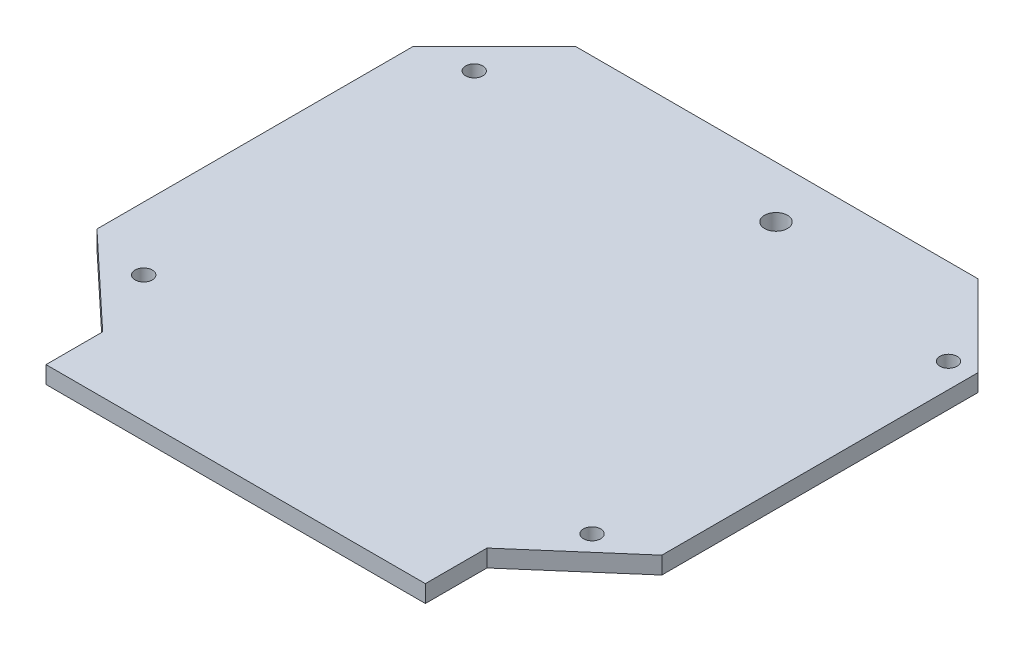
ISO-10303-21;
HEADER;
FILE_DESCRIPTION(('STEP AP214'),'2;1');
FILE_NAME('part.step','',(''),(''),'','','');
FILE_SCHEMA(('AUTOMOTIVE_DESIGN { 1 0 10303 214 1 1 1 1 }'));
ENDSEC;
DATA;
#1=APPLICATION_CONTEXT('core data for automotive mechanical design processes');
#2=APPLICATION_PROTOCOL_DEFINITION('international standard','automotive_design',2000,#1);
#3=PRODUCT_CONTEXT('',#1,'mechanical');
#4=PRODUCT('Part','Part','',(#3));
#5=PRODUCT_RELATED_PRODUCT_CATEGORY('part','',(#4));
#6=PRODUCT_DEFINITION_FORMATION('','',#4);
#7=PRODUCT_DEFINITION_CONTEXT('part definition',#1,'design');
#8=PRODUCT_DEFINITION('design','',#6,#7);
#9=PRODUCT_DEFINITION_SHAPE('','',#8);
#10=(LENGTH_UNIT() NAMED_UNIT(*) SI_UNIT(.MILLI.,.METRE.));
#11=(NAMED_UNIT(*) PLANE_ANGLE_UNIT() SI_UNIT($,.RADIAN.));
#12=(NAMED_UNIT(*) SI_UNIT($,.STERADIAN.) SOLID_ANGLE_UNIT());
#13=UNCERTAINTY_MEASURE_WITH_UNIT(LENGTH_MEASURE(1.E-05),#10,'distance_accuracy_value','');
#14=(GEOMETRIC_REPRESENTATION_CONTEXT(3) GLOBAL_UNCERTAINTY_ASSIGNED_CONTEXT((#13)) GLOBAL_UNIT_ASSIGNED_CONTEXT((#10,
#11,#12)) REPRESENTATION_CONTEXT('',''));
#15=CARTESIAN_POINT('',(0.,0.,0.));
#16=DIRECTION('',(0.,0.,1.));
#17=DIRECTION('',(1.,0.,0.));
#18=AXIS2_PLACEMENT_3D('',#15,#16,#17);
#19=CARTESIAN_POINT('',(0.,3.,0.));
#20=DIRECTION('',(0.,-1.,0.));
#21=DIRECTION('',(0.,0.,-1.));
#22=AXIS2_PLACEMENT_3D('',#19,#20,#21);
#23=PLANE('',#22);
#24=DIRECTION('',(-0.707106781186548,0.,0.707106781186547));
#25=VECTOR('',#24,1.);
#26=CARTESIAN_POINT('',(0.,3.,14.14));
#27=LINE('',#26,#25);
#28=CARTESIAN_POINT('',(14.14,3.,0.));
#29=VERTEX_POINT('',#28);
#30=CARTESIAN_POINT('',(0.,3.,14.14));
#31=VERTEX_POINT('',#30);
#32=EDGE_CURVE('E169',#29,#31,#27,.T.);
#33=ORIENTED_EDGE('',*,*,#32,.T.);
#34=DIRECTION('',(0.,0.,1.));
#35=VECTOR('',#34,1.);
#36=CARTESIAN_POINT('',(0.,3.,69.14));
#37=LINE('',#36,#35);
#38=CARTESIAN_POINT('',(0.,3.,69.14));
#39=VERTEX_POINT('',#38);
#40=EDGE_CURVE('E107',#31,#39,#37,.T.);
#41=ORIENTED_EDGE('',*,*,#40,.T.);
#42=DIRECTION('',(0.729537204140085,0.,0.68394112888133));
#43=VECTOR('',#42,1.);
#44=CARTESIAN_POINT('',(16.,3.,84.14));
#45=LINE('',#44,#43);
#46=CARTESIAN_POINT('',(16.,3.,84.14));
#47=VERTEX_POINT('',#46);
#48=EDGE_CURVE('E190',#39,#47,#45,.T.);
#49=ORIENTED_EDGE('',*,*,#48,.T.);
#50=DIRECTION('',(0.,0.,1.));
#51=VECTOR('',#50,1.);
#52=CARTESIAN_POINT('',(16.,3.,94.));
#53=LINE('',#52,#51);
#54=CARTESIAN_POINT('',(16.,3.,94.));
#55=VERTEX_POINT('',#54);
#56=EDGE_CURVE('E209',#47,#55,#53,.T.);
#57=ORIENTED_EDGE('',*,*,#56,.T.);
#58=DIRECTION('',(1.,0.,0.));
#59=VECTOR('',#58,1.);
#60=CARTESIAN_POINT('',(82.,3.,94.));
#61=LINE('',#60,#59);
#62=CARTESIAN_POINT('',(82.,3.,94.));
#63=VERTEX_POINT('',#62);
#64=EDGE_CURVE('E206',#55,#63,#61,.T.);
#65=ORIENTED_EDGE('',*,*,#64,.T.);
#66=DIRECTION('',(0.,0.,-1.));
#67=VECTOR('',#66,1.);
#68=CARTESIAN_POINT('',(82.,3.,83.28));
#69=LINE('',#68,#67);
#70=CARTESIAN_POINT('',(82.,3.,83.28));
#71=VERTEX_POINT('',#70);
#72=EDGE_CURVE('E208',#63,#71,#69,.T.);
#73=ORIENTED_EDGE('',*,*,#72,.T.);
#74=DIRECTION('',(0.754984782363871,0.,-0.65574231097206));
#75=VECTOR('',#74,1.);
#76=CARTESIAN_POINT('',(98.28,3.,69.14));
#77=LINE('',#76,#75);
#78=CARTESIAN_POINT('',(98.28,3.,69.14));
#79=VERTEX_POINT('',#78);
#80=EDGE_CURVE('E132',#71,#79,#77,.T.);
#81=ORIENTED_EDGE('',*,*,#80,.T.);
#82=DIRECTION('',(0.,0.,-1.));
#83=VECTOR('',#82,1.);
#84=CARTESIAN_POINT('',(98.28,3.,14.14));
#85=LINE('',#84,#83);
#86=CARTESIAN_POINT('',(98.28,3.,14.14));
#87=VERTEX_POINT('',#86);
#88=EDGE_CURVE('E126',#79,#87,#85,.T.);
#89=ORIENTED_EDGE('',*,*,#88,.T.);
#90=DIRECTION('',(-0.707106781186547,0.,-0.707106781186548));
#91=VECTOR('',#90,1.);
#92=CARTESIAN_POINT('',(84.14,3.,0.));
#93=LINE('',#92,#91);
#94=CARTESIAN_POINT('',(84.14,3.,0.));
#95=VERTEX_POINT('',#94);
#96=EDGE_CURVE('E130',#87,#95,#93,.T.);
#97=ORIENTED_EDGE('',*,*,#96,.T.);
#98=DIRECTION('',(-1.,0.,0.));
#99=VECTOR('',#98,1.);
#100=CARTESIAN_POINT('',(14.14,3.,0.));
#101=LINE('',#100,#99);
#102=EDGE_CURVE('E58',#95,#29,#101,.T.);
#103=ORIENTED_EDGE('',*,*,#102,.T.);
#104=EDGE_LOOP('',(#33,#41,#49,#57,#65,#73,#81,#89,#97,#103));
#105=FACE_BOUND('',#104,.T.);
#106=CARTESIAN_POINT('',(9.,3.,12.5));
#107=DIRECTION('',(0.,1.,0.));
#108=DIRECTION('',(0.,0.,1.));
#109=AXIS2_PLACEMENT_3D('',#106,#107,#108);
#110=CIRCLE('',#109,1.5);
#111=CARTESIAN_POINT('',(9.,3.,14.));
#112=VERTEX_POINT('',#111);
#113=EDGE_CURVE('E154',#112,#112,#110,.T.);
#114=ORIENTED_EDGE('',*,*,#113,.F.);
#115=EDGE_LOOP('',(#114));
#116=FACE_BOUND('',#115,.T.);
#117=CARTESIAN_POINT('',(94.,3.,15.));
#118=DIRECTION('',(0.,1.,0.));
#119=DIRECTION('',(0.,0.,1.));
#120=AXIS2_PLACEMENT_3D('',#117,#118,#119);
#121=CIRCLE('',#120,1.5);
#122=CARTESIAN_POINT('',(94.,3.,16.5));
#123=VERTEX_POINT('',#122);
#124=EDGE_CURVE('E220',#123,#123,#121,.T.);
#125=ORIENTED_EDGE('',*,*,#124,.F.);
#126=EDGE_LOOP('',(#125));
#127=FACE_BOUND('',#126,.T.);
#128=CARTESIAN_POINT('',(11.,3.,72.));
#129=DIRECTION('',(0.,1.,0.));
#130=DIRECTION('',(0.,0.,1.));
#131=AXIS2_PLACEMENT_3D('',#128,#129,#130);
#132=CIRCLE('',#131,1.5);
#133=CARTESIAN_POINT('',(11.,3.,73.5));
#134=VERTEX_POINT('',#133);
#135=EDGE_CURVE('E226',#134,#134,#132,.T.);
#136=ORIENTED_EDGE('',*,*,#135,.F.);
#137=EDGE_LOOP('',(#136));
#138=FACE_BOUND('',#137,.T.);
#139=CARTESIAN_POINT('',(89.,3.,72.));
#140=DIRECTION('',(0.,1.,0.));
#141=DIRECTION('',(0.,0.,1.));
#142=AXIS2_PLACEMENT_3D('',#139,#140,#141);
#143=CIRCLE('',#142,1.5);
#144=CARTESIAN_POINT('',(89.,3.,73.5));
#145=VERTEX_POINT('',#144);
#146=EDGE_CURVE('E232',#145,#145,#143,.T.);
#147=ORIENTED_EDGE('',*,*,#146,.F.);
#148=EDGE_LOOP('',(#147));
#149=FACE_BOUND('',#148,.T.);
#150=CARTESIAN_POINT('',(58.,3.,8.99999999999999));
#151=DIRECTION('',(0.,1.,0.));
#152=DIRECTION('',(0.,0.,1.));
#153=AXIS2_PLACEMENT_3D('',#150,#151,#152);
#154=CIRCLE('',#153,2.);
#155=CARTESIAN_POINT('',(58.,3.,11.));
#156=VERTEX_POINT('',#155);
#157=EDGE_CURVE('E238',#156,#156,#154,.T.);
#158=ORIENTED_EDGE('',*,*,#157,.F.);
#159=EDGE_LOOP('',(#158));
#160=FACE_BOUND('',#159,.T.);
#161=ADVANCED_FACE('F41',(#105,#116,#127,#138,#149,#160),#23,.F.);
#162=CARTESIAN_POINT('',(0.,0.,0.));
#163=DIRECTION('',(0.,-1.,0.));
#164=DIRECTION('',(0.,0.,-1.));
#165=AXIS2_PLACEMENT_3D('',#162,#163,#164);
#166=PLANE('',#165);
#167=CARTESIAN_POINT('',(89.,0.,72.));
#168=DIRECTION('',(0.,1.,0.));
#169=DIRECTION('',(0.,0.,1.));
#170=AXIS2_PLACEMENT_3D('',#167,#168,#169);
#171=CIRCLE('',#170,1.5);
#172=CARTESIAN_POINT('',(89.,0.,73.5));
#173=VERTEX_POINT('',#172);
#174=EDGE_CURVE('E235',#173,#173,#171,.T.);
#175=ORIENTED_EDGE('',*,*,#174,.T.);
#176=EDGE_LOOP('',(#175));
#177=FACE_BOUND('',#176,.T.);
#178=CARTESIAN_POINT('',(94.,0.,15.));
#179=DIRECTION('',(0.,1.,0.));
#180=DIRECTION('',(0.,0.,1.));
#181=AXIS2_PLACEMENT_3D('',#178,#179,#180);
#182=CIRCLE('',#181,1.5);
#183=CARTESIAN_POINT('',(94.,0.,16.5));
#184=VERTEX_POINT('',#183);
#185=EDGE_CURVE('E223',#184,#184,#182,.T.);
#186=ORIENTED_EDGE('',*,*,#185,.T.);
#187=EDGE_LOOP('',(#186));
#188=FACE_BOUND('',#187,.T.);
#189=DIRECTION('',(-0.707106781186548,0.,0.707106781186547));
#190=VECTOR('',#189,1.);
#191=CARTESIAN_POINT('',(0.,0.,14.14));
#192=LINE('',#191,#190);
#193=CARTESIAN_POINT('',(14.14,0.,0.));
#194=VERTEX_POINT('',#193);
#195=CARTESIAN_POINT('',(0.,0.,14.14));
#196=VERTEX_POINT('',#195);
#197=EDGE_CURVE('E150',#194,#196,#192,.T.);
#198=ORIENTED_EDGE('',*,*,#197,.F.);
#199=DIRECTION('',(-1.,0.,0.));
#200=VECTOR('',#199,1.);
#201=CARTESIAN_POINT('',(14.14,0.,0.));
#202=LINE('',#201,#200);
#203=CARTESIAN_POINT('',(84.14,0.,0.));
#204=VERTEX_POINT('',#203);
#205=EDGE_CURVE('E99',#204,#194,#202,.T.);
#206=ORIENTED_EDGE('',*,*,#205,.F.);
#207=DIRECTION('',(-0.707106781186547,0.,-0.707106781186548));
#208=VECTOR('',#207,1.);
#209=CARTESIAN_POINT('',(84.14,0.,0.));
#210=LINE('',#209,#208);
#211=CARTESIAN_POINT('',(98.28,0.,14.14));
#212=VERTEX_POINT('',#211);
#213=EDGE_CURVE('E93',#212,#204,#210,.T.);
#214=ORIENTED_EDGE('',*,*,#213,.F.);
#215=DIRECTION('',(0.,0.,-1.));
#216=VECTOR('',#215,1.);
#217=CARTESIAN_POINT('',(98.28,0.,14.14));
#218=LINE('',#217,#216);
#219=CARTESIAN_POINT('',(98.28,0.,69.14));
#220=VERTEX_POINT('',#219);
#221=EDGE_CURVE('E140',#220,#212,#218,.T.);
#222=ORIENTED_EDGE('',*,*,#221,.F.);
#223=DIRECTION('',(0.754984782363871,0.,-0.65574231097206));
#224=VECTOR('',#223,1.);
#225=CARTESIAN_POINT('',(98.28,0.,69.14));
#226=LINE('',#225,#224);
#227=CARTESIAN_POINT('',(82.,0.,83.28));
#228=VERTEX_POINT('',#227);
#229=EDGE_CURVE('E164',#228,#220,#226,.T.);
#230=ORIENTED_EDGE('',*,*,#229,.F.);
#231=DIRECTION('',(0.,0.,-1.));
#232=VECTOR('',#231,1.);
#233=CARTESIAN_POINT('',(82.,0.,83.28));
#234=LINE('',#233,#232);
#235=CARTESIAN_POINT('',(82.,0.,94.));
#236=VERTEX_POINT('',#235);
#237=EDGE_CURVE('E162',#236,#228,#234,.T.);
#238=ORIENTED_EDGE('',*,*,#237,.F.);
#239=DIRECTION('',(1.,0.,0.));
#240=VECTOR('',#239,1.);
#241=CARTESIAN_POINT('',(82.,0.,94.));
#242=LINE('',#241,#240);
#243=CARTESIAN_POINT('',(16.,0.,94.));
#244=VERTEX_POINT('',#243);
#245=EDGE_CURVE('E160',#244,#236,#242,.T.);
#246=ORIENTED_EDGE('',*,*,#245,.F.);
#247=DIRECTION('',(0.,0.,1.));
#248=VECTOR('',#247,1.);
#249=CARTESIAN_POINT('',(16.,0.,94.));
#250=LINE('',#249,#248);
#251=CARTESIAN_POINT('',(16.,0.,84.14));
#252=VERTEX_POINT('',#251);
#253=EDGE_CURVE('E158',#252,#244,#250,.T.);
#254=ORIENTED_EDGE('',*,*,#253,.F.);
#255=DIRECTION('',(0.729537204140085,0.,0.68394112888133));
#256=VECTOR('',#255,1.);
#257=CARTESIAN_POINT('',(16.,0.,84.14));
#258=LINE('',#257,#256);
#259=CARTESIAN_POINT('',(0.,0.,69.14));
#260=VERTEX_POINT('',#259);
#261=EDGE_CURVE('E156',#260,#252,#258,.T.);
#262=ORIENTED_EDGE('',*,*,#261,.F.);
#263=DIRECTION('',(0.,0.,1.));
#264=VECTOR('',#263,1.);
#265=CARTESIAN_POINT('',(0.,0.,69.14));
#266=LINE('',#265,#264);
#267=EDGE_CURVE('E153',#196,#260,#266,.T.);
#268=ORIENTED_EDGE('',*,*,#267,.F.);
#269=EDGE_LOOP('',(#198,#206,#214,#222,#230,#238,#246,#254,#262,#268));
#270=FACE_BOUND('',#269,.T.);
#271=CARTESIAN_POINT('',(9.,0.,12.5));
#272=DIRECTION('',(0.,1.,0.));
#273=DIRECTION('',(0.,0.,1.));
#274=AXIS2_PLACEMENT_3D('',#271,#272,#273);
#275=CIRCLE('',#274,1.5);
#276=CARTESIAN_POINT('',(9.,0.,14.));
#277=VERTEX_POINT('',#276);
#278=EDGE_CURVE('E217',#277,#277,#275,.T.);
#279=ORIENTED_EDGE('',*,*,#278,.T.);
#280=EDGE_LOOP('',(#279));
#281=FACE_BOUND('',#280,.T.);
#282=CARTESIAN_POINT('',(11.,0.,72.));
#283=DIRECTION('',(0.,1.,0.));
#284=DIRECTION('',(0.,0.,1.));
#285=AXIS2_PLACEMENT_3D('',#282,#283,#284);
#286=CIRCLE('',#285,1.5);
#287=CARTESIAN_POINT('',(11.,0.,73.5));
#288=VERTEX_POINT('',#287);
#289=EDGE_CURVE('E229',#288,#288,#286,.T.);
#290=ORIENTED_EDGE('',*,*,#289,.T.);
#291=EDGE_LOOP('',(#290));
#292=FACE_BOUND('',#291,.T.);
#293=CARTESIAN_POINT('',(58.,0.,8.99999999999999));
#294=DIRECTION('',(0.,1.,0.));
#295=DIRECTION('',(0.,0.,1.));
#296=AXIS2_PLACEMENT_3D('',#293,#294,#295);
#297=CIRCLE('',#296,2.);
#298=CARTESIAN_POINT('',(58.,0.,11.));
#299=VERTEX_POINT('',#298);
#300=EDGE_CURVE('E241',#299,#299,#297,.T.);
#301=ORIENTED_EDGE('',*,*,#300,.T.);
#302=EDGE_LOOP('',(#301));
#303=FACE_BOUND('',#302,.T.);
#304=ADVANCED_FACE('F194',(#177,#188,#270,#281,#292,#303),#166,.T.);
#305=CARTESIAN_POINT('',(0.,3.,14.14));
#306=DIRECTION('',(0.707106781186547,0.,0.707106781186548));
#307=DIRECTION('',(0.707106781186548,0.,-0.707106781186547));
#308=AXIS2_PLACEMENT_3D('',#305,#306,#307);
#309=PLANE('',#308);
#310=ORIENTED_EDGE('',*,*,#197,.T.);
#311=DIRECTION('',(0.,-1.,0.));
#312=VECTOR('',#311,1.);
#313=CARTESIAN_POINT('',(0.,3.,14.14));
#314=LINE('',#313,#312);
#315=EDGE_CURVE('E11',#31,#196,#314,.T.);
#316=ORIENTED_EDGE('',*,*,#315,.F.);
#317=ORIENTED_EDGE('',*,*,#32,.F.);
#318=DIRECTION('',(0.,-1.,0.));
#319=VECTOR('',#318,1.);
#320=CARTESIAN_POINT('',(14.14,3.,0.));
#321=LINE('',#320,#319);
#322=EDGE_CURVE('E146',#29,#194,#321,.T.);
#323=ORIENTED_EDGE('',*,*,#322,.T.);
#324=EDGE_LOOP('',(#310,#316,#317,#323));
#325=FACE_BOUND('',#324,.T.);
#326=ADVANCED_FACE('F43',(#325),#309,.F.);
#327=CARTESIAN_POINT('',(0.,3.,69.14));
#328=DIRECTION('',(1.,0.,0.));
#329=DIRECTION('',(0.,0.,-1.));
#330=AXIS2_PLACEMENT_3D('',#327,#328,#329);
#331=PLANE('',#330);
#332=ORIENTED_EDGE('',*,*,#267,.T.);
#333=DIRECTION('',(0.,-1.,0.));
#334=VECTOR('',#333,1.);
#335=CARTESIAN_POINT('',(0.,3.,69.14));
#336=LINE('',#335,#334);
#337=EDGE_CURVE('E50',#39,#260,#336,.T.);
#338=ORIENTED_EDGE('',*,*,#337,.F.);
#339=ORIENTED_EDGE('',*,*,#40,.F.);
#340=ORIENTED_EDGE('',*,*,#315,.T.);
#341=EDGE_LOOP('',(#332,#338,#339,#340));
#342=FACE_BOUND('',#341,.T.);
#343=ADVANCED_FACE('F281',(#342),#331,.F.);
#344=CARTESIAN_POINT('',(16.,3.,84.14));
#345=DIRECTION('',(0.68394112888133,0.,-0.729537204140085));
#346=DIRECTION('',(-0.729537204140085,0.,-0.68394112888133));
#347=AXIS2_PLACEMENT_3D('',#344,#345,#346);
#348=PLANE('',#347);
#349=ORIENTED_EDGE('',*,*,#261,.T.);
#350=DIRECTION('',(0.,-1.,0.));
#351=VECTOR('',#350,1.);
#352=CARTESIAN_POINT('',(16.,3.,84.14));
#353=LINE('',#352,#351);
#354=EDGE_CURVE('E182',#47,#252,#353,.T.);
#355=ORIENTED_EDGE('',*,*,#354,.F.);
#356=ORIENTED_EDGE('',*,*,#48,.F.);
#357=ORIENTED_EDGE('',*,*,#337,.T.);
#358=EDGE_LOOP('',(#349,#355,#356,#357));
#359=FACE_BOUND('',#358,.T.);
#360=ADVANCED_FACE('F188',(#359),#348,.F.);
#361=CARTESIAN_POINT('',(16.,3.,94.));
#362=DIRECTION('',(1.,0.,0.));
#363=DIRECTION('',(0.,0.,-1.));
#364=AXIS2_PLACEMENT_3D('',#361,#362,#363);
#365=PLANE('',#364);
#366=ORIENTED_EDGE('',*,*,#253,.T.);
#367=DIRECTION('',(0.,-1.,0.));
#368=VECTOR('',#367,1.);
#369=CARTESIAN_POINT('',(16.,3.,94.));
#370=LINE('',#369,#368);
#371=EDGE_CURVE('E179',#55,#244,#370,.T.);
#372=ORIENTED_EDGE('',*,*,#371,.F.);
#373=ORIENTED_EDGE('',*,*,#56,.F.);
#374=ORIENTED_EDGE('',*,*,#354,.T.);
#375=EDGE_LOOP('',(#366,#372,#373,#374));
#376=FACE_BOUND('',#375,.T.);
#377=ADVANCED_FACE('F200',(#376),#365,.F.);
#378=CARTESIAN_POINT('',(82.,3.,94.));
#379=DIRECTION('',(0.,0.,-1.));
#380=DIRECTION('',(-1.,0.,0.));
#381=AXIS2_PLACEMENT_3D('',#378,#379,#380);
#382=PLANE('',#381);
#383=ORIENTED_EDGE('',*,*,#245,.T.);
#384=DIRECTION('',(0.,-1.,0.));
#385=VECTOR('',#384,1.);
#386=CARTESIAN_POINT('',(82.,3.,94.));
#387=LINE('',#386,#385);
#388=EDGE_CURVE('E176',#63,#236,#387,.T.);
#389=ORIENTED_EDGE('',*,*,#388,.F.);
#390=ORIENTED_EDGE('',*,*,#64,.F.);
#391=ORIENTED_EDGE('',*,*,#371,.T.);
#392=EDGE_LOOP('',(#383,#389,#390,#391));
#393=FACE_BOUND('',#392,.T.);
#394=ADVANCED_FACE('F204',(#393),#382,.F.);
#395=CARTESIAN_POINT('',(82.,3.,83.28));
#396=DIRECTION('',(-1.,0.,0.));
#397=DIRECTION('',(0.,0.,1.));
#398=AXIS2_PLACEMENT_3D('',#395,#396,#397);
#399=PLANE('',#398);
#400=ORIENTED_EDGE('',*,*,#237,.T.);
#401=DIRECTION('',(0.,-1.,0.));
#402=VECTOR('',#401,1.);
#403=CARTESIAN_POINT('',(82.,3.,83.28));
#404=LINE('',#403,#402);
#405=EDGE_CURVE('E173',#71,#228,#404,.T.);
#406=ORIENTED_EDGE('',*,*,#405,.F.);
#407=ORIENTED_EDGE('',*,*,#72,.F.);
#408=ORIENTED_EDGE('',*,*,#388,.T.);
#409=EDGE_LOOP('',(#400,#406,#407,#408));
#410=FACE_BOUND('',#409,.T.);
#411=ADVANCED_FACE('F271',(#410),#399,.F.);
#412=CARTESIAN_POINT('',(98.28,3.,69.14));
#413=DIRECTION('',(-0.65574231097206,0.,-0.754984782363871));
#414=DIRECTION('',(-0.754984782363871,0.,0.65574231097206));
#415=AXIS2_PLACEMENT_3D('',#412,#413,#414);
#416=PLANE('',#415);
#417=ORIENTED_EDGE('',*,*,#229,.T.);
#418=DIRECTION('',(0.,-1.,0.));
#419=VECTOR('',#418,1.);
#420=CARTESIAN_POINT('',(98.28,3.,69.14));
#421=LINE('',#420,#419);
#422=EDGE_CURVE('E141',#79,#220,#421,.T.);
#423=ORIENTED_EDGE('',*,*,#422,.F.);
#424=ORIENTED_EDGE('',*,*,#80,.F.);
#425=ORIENTED_EDGE('',*,*,#405,.T.);
#426=EDGE_LOOP('',(#417,#423,#424,#425));
#427=FACE_BOUND('',#426,.T.);
#428=ADVANCED_FACE('F268',(#427),#416,.F.);
#429=CARTESIAN_POINT('',(98.28,3.,14.14));
#430=DIRECTION('',(-1.,0.,0.));
#431=DIRECTION('',(0.,0.,1.));
#432=AXIS2_PLACEMENT_3D('',#429,#430,#431);
#433=PLANE('',#432);
#434=ORIENTED_EDGE('',*,*,#221,.T.);
#435=DIRECTION('',(0.,-1.,0.));
#436=VECTOR('',#435,1.);
#437=CARTESIAN_POINT('',(98.28,3.,14.14));
#438=LINE('',#437,#436);
#439=EDGE_CURVE('E137',#87,#212,#438,.T.);
#440=ORIENTED_EDGE('',*,*,#439,.F.);
#441=ORIENTED_EDGE('',*,*,#88,.F.);
#442=ORIENTED_EDGE('',*,*,#422,.T.);
#443=EDGE_LOOP('',(#434,#440,#441,#442));
#444=FACE_BOUND('',#443,.T.);
#445=ADVANCED_FACE('F138',(#444),#433,.F.);
#446=CARTESIAN_POINT('',(84.14,3.,0.));
#447=DIRECTION('',(-0.707106781186548,0.,0.707106781186547));
#448=DIRECTION('',(0.707106781186547,0.,0.707106781186548));
#449=AXIS2_PLACEMENT_3D('',#446,#447,#448);
#450=PLANE('',#449);
#451=ORIENTED_EDGE('',*,*,#213,.T.);
#452=DIRECTION('',(0.,-1.,0.));
#453=VECTOR('',#452,1.);
#454=CARTESIAN_POINT('',(84.14,3.,0.));
#455=LINE('',#454,#453);
#456=EDGE_CURVE('E142',#95,#204,#455,.T.);
#457=ORIENTED_EDGE('',*,*,#456,.F.);
#458=ORIENTED_EDGE('',*,*,#96,.F.);
#459=ORIENTED_EDGE('',*,*,#439,.T.);
#460=EDGE_LOOP('',(#451,#457,#458,#459));
#461=FACE_BOUND('',#460,.T.);
#462=ADVANCED_FACE('F144',(#461),#450,.F.);
#463=CARTESIAN_POINT('',(14.14,3.,0.));
#464=DIRECTION('',(0.,0.,1.));
#465=DIRECTION('',(1.,0.,0.));
#466=AXIS2_PLACEMENT_3D('',#463,#464,#465);
#467=PLANE('',#466);
#468=ORIENTED_EDGE('',*,*,#205,.T.);
#469=ORIENTED_EDGE('',*,*,#322,.F.);
#470=ORIENTED_EDGE('',*,*,#102,.F.);
#471=ORIENTED_EDGE('',*,*,#456,.T.);
#472=EDGE_LOOP('',(#468,#469,#470,#471));
#473=FACE_BOUND('',#472,.T.);
#474=ADVANCED_FACE('F261',(#473),#467,.F.);
#475=CARTESIAN_POINT('',(9.,3.,12.5));
#476=DIRECTION('',(0.,-1.,0.));
#477=DIRECTION('',(0.,0.,-1.));
#478=AXIS2_PLACEMENT_3D('',#475,#476,#477);
#479=CYLINDRICAL_SURFACE('',#478,1.5);
#480=ORIENTED_EDGE('',*,*,#113,.T.);
#481=EDGE_LOOP('',(#480));
#482=FACE_BOUND('',#481,.T.);
#483=ORIENTED_EDGE('',*,*,#278,.F.);
#484=EDGE_LOOP('',(#483));
#485=FACE_BOUND('',#484,.T.);
#486=ADVANCED_FACE('F258',(#482,#485),#479,.F.);
#487=CARTESIAN_POINT('',(94.,3.,15.));
#488=DIRECTION('',(0.,-1.,0.));
#489=DIRECTION('',(0.,0.,-1.));
#490=AXIS2_PLACEMENT_3D('',#487,#488,#489);
#491=CYLINDRICAL_SURFACE('',#490,1.5);
#492=ORIENTED_EDGE('',*,*,#124,.T.);
#493=EDGE_LOOP('',(#492));
#494=FACE_BOUND('',#493,.T.);
#495=ORIENTED_EDGE('',*,*,#185,.F.);
#496=EDGE_LOOP('',(#495));
#497=FACE_BOUND('',#496,.T.);
#498=ADVANCED_FACE('F356',(#494,#497),#491,.F.);
#499=CARTESIAN_POINT('',(11.,3.,72.));
#500=DIRECTION('',(0.,-1.,0.));
#501=DIRECTION('',(0.,0.,-1.));
#502=AXIS2_PLACEMENT_3D('',#499,#500,#501);
#503=CYLINDRICAL_SURFACE('',#502,1.5);
#504=ORIENTED_EDGE('',*,*,#135,.T.);
#505=EDGE_LOOP('',(#504));
#506=FACE_BOUND('',#505,.T.);
#507=ORIENTED_EDGE('',*,*,#289,.F.);
#508=EDGE_LOOP('',(#507));
#509=FACE_BOUND('',#508,.T.);
#510=ADVANCED_FACE('F364',(#506,#509),#503,.F.);
#511=CARTESIAN_POINT('',(89.,3.,72.));
#512=DIRECTION('',(0.,-1.,0.));
#513=DIRECTION('',(0.,0.,-1.));
#514=AXIS2_PLACEMENT_3D('',#511,#512,#513);
#515=CYLINDRICAL_SURFACE('',#514,1.5);
#516=ORIENTED_EDGE('',*,*,#146,.T.);
#517=EDGE_LOOP('',(#516));
#518=FACE_BOUND('',#517,.T.);
#519=ORIENTED_EDGE('',*,*,#174,.F.);
#520=EDGE_LOOP('',(#519));
#521=FACE_BOUND('',#520,.T.);
#522=ADVANCED_FACE('F372',(#518,#521),#515,.F.);
#523=CARTESIAN_POINT('',(58.,3.,8.99999999999999));
#524=DIRECTION('',(0.,-1.,0.));
#525=DIRECTION('',(0.,0.,-1.));
#526=AXIS2_PLACEMENT_3D('',#523,#524,#525);
#527=CYLINDRICAL_SURFACE('',#526,2.);
#528=ORIENTED_EDGE('',*,*,#157,.T.);
#529=EDGE_LOOP('',(#528));
#530=FACE_BOUND('',#529,.T.);
#531=ORIENTED_EDGE('',*,*,#300,.F.);
#532=EDGE_LOOP('',(#531));
#533=FACE_BOUND('',#532,.T.);
#534=ADVANCED_FACE('F247',(#530,#533),#527,.F.);
#535=CLOSED_SHELL('',(#161,#304,#326,#343,#360,#377,#394,#411,#428,#445,#462,#474,#486,#498,
#510,#522,#534));
#536=MANIFOLD_SOLID_BREP('B2',#535);
#537=ADVANCED_BREP_SHAPE_REPRESENTATION('',(#18,#536),#14);
#538=SHAPE_DEFINITION_REPRESENTATION(#9,#537);
ENDSEC;
END-ISO-10303-21;
